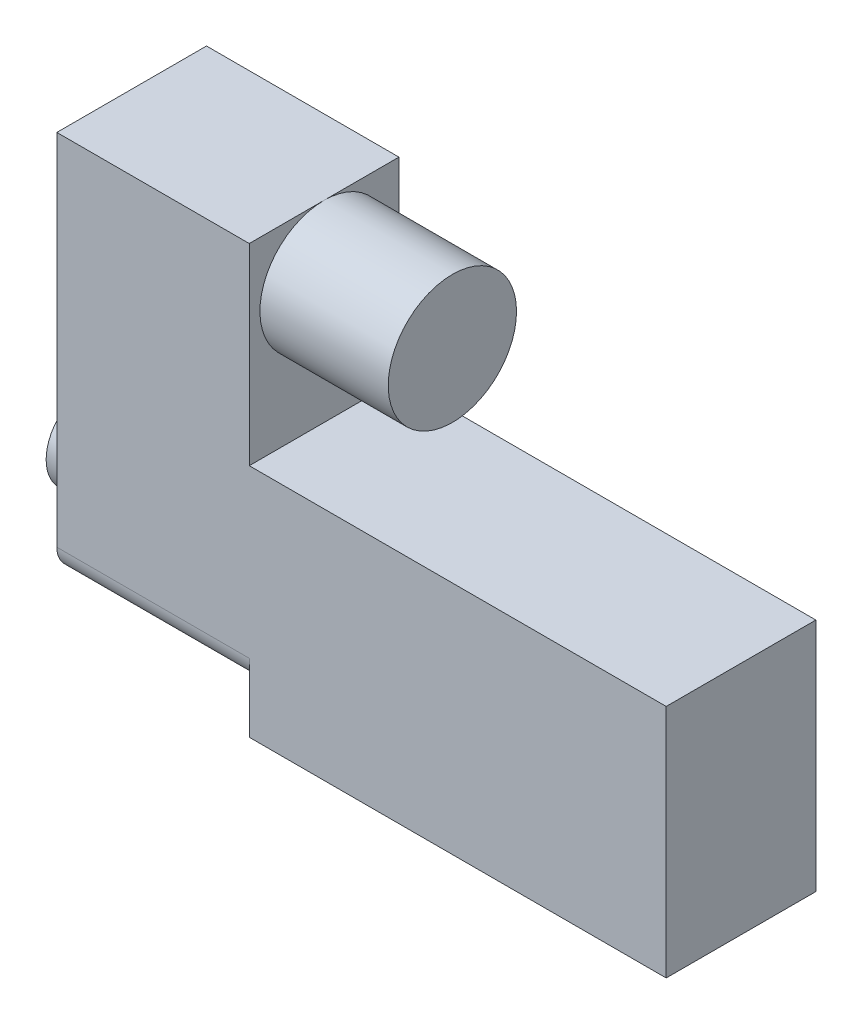
ISO-10303-21;
HEADER;
FILE_DESCRIPTION(('STEP AP214'),'2;1');
FILE_NAME('part.step','',(''),(''),'','','');
FILE_SCHEMA(('AUTOMOTIVE_DESIGN { 1 0 10303 214 1 1 1 1 }'));
ENDSEC;
DATA;
#1=APPLICATION_CONTEXT('core data for automotive mechanical design processes');
#2=APPLICATION_PROTOCOL_DEFINITION('international standard','automotive_design',2000,#1);
#3=PRODUCT_CONTEXT('',#1,'mechanical');
#4=PRODUCT('Part','Part','',(#3));
#5=PRODUCT_RELATED_PRODUCT_CATEGORY('part','',(#4));
#6=PRODUCT_DEFINITION_FORMATION('','',#4);
#7=PRODUCT_DEFINITION_CONTEXT('part definition',#1,'design');
#8=PRODUCT_DEFINITION('design','',#6,#7);
#9=PRODUCT_DEFINITION_SHAPE('','',#8);
#10=(LENGTH_UNIT() NAMED_UNIT(*) SI_UNIT(.MILLI.,.METRE.));
#11=(NAMED_UNIT(*) PLANE_ANGLE_UNIT() SI_UNIT($,.RADIAN.));
#12=(NAMED_UNIT(*) SI_UNIT($,.STERADIAN.) SOLID_ANGLE_UNIT());
#13=UNCERTAINTY_MEASURE_WITH_UNIT(LENGTH_MEASURE(1.E-05),#10,'distance_accuracy_value','');
#14=(GEOMETRIC_REPRESENTATION_CONTEXT(3) GLOBAL_UNCERTAINTY_ASSIGNED_CONTEXT((#13)) GLOBAL_UNIT_ASSIGNED_CONTEXT((#10,
#11,#12)) REPRESENTATION_CONTEXT('',''));
#15=CARTESIAN_POINT('',(0.,0.,0.));
#16=DIRECTION('',(0.,0.,1.));
#17=DIRECTION('',(1.,0.,0.));
#18=AXIS2_PLACEMENT_3D('',#15,#16,#17);
#19=CARTESIAN_POINT('',(-28.575,0.,0.));
#20=DIRECTION('',(-1.,0.,0.));
#21=DIRECTION('',(0.,0.,1.));
#22=AXIS2_PLACEMENT_3D('',#19,#20,#21);
#23=PLANE('',#22);
#24=DIRECTION('',(0.,-1.,0.));
#25=VECTOR('',#24,1.);
#26=CARTESIAN_POINT('',(-28.575,34.925,-22.225));
#27=LINE('',#26,#25);
#28=CARTESIAN_POINT('',(-28.575,63.5,-22.225));
#29=VERTEX_POINT('',#28);
#30=CARTESIAN_POINT('',(-28.575,10.16,-22.225));
#31=VERTEX_POINT('',#30);
#32=EDGE_CURVE('E143',#29,#31,#27,.T.);
#33=ORIENTED_EDGE('',*,*,#32,.T.);
#34=CARTESIAN_POINT('',(-28.575,10.16,-18.415));
#35=DIRECTION('',(-1.,0.,0.));
#36=DIRECTION('',(0.,0.,1.));
#37=AXIS2_PLACEMENT_3D('',#34,#35,#36);
#38=CIRCLE('',#37,3.81);
#39=CARTESIAN_POINT('',(-28.575,6.35,-18.415));
#40=VERTEX_POINT('',#39);
#41=EDGE_CURVE('E212',#31,#40,#38,.T.);
#42=ORIENTED_EDGE('',*,*,#41,.T.);
#43=DIRECTION('',(0.,0.,1.));
#44=VECTOR('',#43,1.);
#45=CARTESIAN_POINT('',(-28.575,6.35,-22.225));
#46=LINE('',#45,#44);
#47=CARTESIAN_POINT('',(-28.575,6.35,-3.81));
#48=VERTEX_POINT('',#47);
#49=EDGE_CURVE('E227',#40,#48,#46,.T.);
#50=ORIENTED_EDGE('',*,*,#49,.T.);
#51=CARTESIAN_POINT('',(-28.575,10.16,-3.81));
#52=DIRECTION('',(-1.,0.,0.));
#53=DIRECTION('',(0.,0.,1.));
#54=AXIS2_PLACEMENT_3D('',#51,#52,#53);
#55=CIRCLE('',#54,3.81);
#56=CARTESIAN_POINT('',(-28.575,10.16,0.));
#57=VERTEX_POINT('',#56);
#58=EDGE_CURVE('E57',#48,#57,#55,.T.);
#59=ORIENTED_EDGE('',*,*,#58,.T.);
#60=DIRECTION('',(0.,1.,0.));
#61=VECTOR('',#60,1.);
#62=CARTESIAN_POINT('',(-28.575,34.925,0.));
#63=LINE('',#62,#61);
#64=CARTESIAN_POINT('',(-28.575,63.5,0.));
#65=VERTEX_POINT('',#64);
#66=EDGE_CURVE('E168',#57,#65,#63,.T.);
#67=ORIENTED_EDGE('',*,*,#66,.T.);
#68=DIRECTION('',(0.,0.,1.));
#69=VECTOR('',#68,1.);
#70=CARTESIAN_POINT('',(-28.575,63.5,-22.225));
#71=LINE('',#70,#69);
#72=EDGE_CURVE('E136',#29,#65,#71,.T.);
#73=ORIENTED_EDGE('',*,*,#72,.F.);
#74=EDGE_LOOP('',(#33,#42,#50,#59,#67,#73));
#75=FACE_BOUND('',#74,.T.);
#76=CARTESIAN_POINT('',(-28.575,15.875,-11.1125));
#77=DIRECTION('',(-1.,0.,0.));
#78=DIRECTION('',(0.,0.,1.));
#79=AXIS2_PLACEMENT_3D('',#76,#77,#78);
#80=CIRCLE('',#79,6.35);
#81=CARTESIAN_POINT('',(-28.575,15.875,-4.76249999999999));
#82=VERTEX_POINT('',#81);
#83=EDGE_CURVE('E245',#82,#82,#80,.T.);
#84=ORIENTED_EDGE('',*,*,#83,.F.);
#85=EDGE_LOOP('',(#84));
#86=FACE_BOUND('',#85,.T.);
#87=ADVANCED_FACE('F35',(#75,#86),#23,.T.);
#88=CARTESIAN_POINT('',(0.,63.5,-22.225));
#89=DIRECTION('',(-1.,0.,0.));
#90=DIRECTION('',(0.,0.,1.));
#91=AXIS2_PLACEMENT_3D('',#88,#89,#90);
#92=PLANE('',#91);
#93=DIRECTION('',(0.,0.,-1.));
#94=VECTOR('',#93,1.);
#95=CARTESIAN_POINT('',(0.,63.5,-22.225));
#96=LINE('',#95,#94);
#97=CARTESIAN_POINT('',(0.,63.5,-11.1125));
#98=VERTEX_POINT('',#97);
#99=CARTESIAN_POINT('',(0.,63.5,-22.225));
#100=VERTEX_POINT('',#99);
#101=EDGE_CURVE('E119',#98,#100,#96,.T.);
#102=ORIENTED_EDGE('',*,*,#101,.F.);
#103=CARTESIAN_POINT('',(0.,53.975,-11.1125));
#104=DIRECTION('',(1.,0.,0.));
#105=DIRECTION('',(0.,0.,-1.));
#106=AXIS2_PLACEMENT_3D('',#103,#104,#105);
#107=CIRCLE('',#106,9.525);
#108=EDGE_CURVE('E131',#98,#98,#107,.T.);
#109=ORIENTED_EDGE('',*,*,#108,.F.);
#110=CARTESIAN_POINT('',(0.,63.5,0.));
#111=VERTEX_POINT('',#110);
#112=EDGE_CURVE('E114',#111,#98,#96,.T.);
#113=ORIENTED_EDGE('',*,*,#112,.F.);
#114=DIRECTION('',(0.,-1.,0.));
#115=VECTOR('',#114,1.);
#116=CARTESIAN_POINT('',(0.,63.5,0.));
#117=LINE('',#116,#115);
#118=CARTESIAN_POINT('',(0.,34.925,0.));
#119=VERTEX_POINT('',#118);
#120=EDGE_CURVE('E154',#111,#119,#117,.T.);
#121=ORIENTED_EDGE('',*,*,#120,.T.);
#122=DIRECTION('',(0.,0.,-1.));
#123=VECTOR('',#122,1.);
#124=CARTESIAN_POINT('',(0.,34.925,-22.225));
#125=LINE('',#124,#123);
#126=CARTESIAN_POINT('',(0.,34.925,-22.225));
#127=VERTEX_POINT('',#126);
#128=EDGE_CURVE('E146',#119,#127,#125,.T.);
#129=ORIENTED_EDGE('',*,*,#128,.T.);
#130=DIRECTION('',(0.,-1.,0.));
#131=VECTOR('',#130,1.);
#132=CARTESIAN_POINT('',(0.,63.5,-22.225));
#133=LINE('',#132,#131);
#134=EDGE_CURVE('E134',#100,#127,#133,.T.);
#135=ORIENTED_EDGE('',*,*,#134,.F.);
#136=EDGE_LOOP('',(#102,#109,#113,#121,#129,#135));
#137=FACE_BOUND('',#136,.T.);
#138=ADVANCED_FACE('F129',(#137),#92,.F.);
#139=CARTESIAN_POINT('',(0.,34.925,0.));
#140=DIRECTION('',(0.,-1.,0.));
#141=DIRECTION('',(0.,0.,-1.));
#142=AXIS2_PLACEMENT_3D('',#139,#140,#141);
#143=PLANE('',#142);
#144=ORIENTED_EDGE('',*,*,#128,.F.);
#145=DIRECTION('',(1.,0.,0.));
#146=VECTOR('',#145,1.);
#147=CARTESIAN_POINT('',(0.,34.925,0.));
#148=LINE('',#147,#146);
#149=CARTESIAN_POINT('',(61.9125,34.925,0.));
#150=VERTEX_POINT('',#149);
#151=EDGE_CURVE('E150',#119,#150,#148,.T.);
#152=ORIENTED_EDGE('',*,*,#151,.T.);
#153=DIRECTION('',(0.,0.,-1.));
#154=VECTOR('',#153,1.);
#155=CARTESIAN_POINT('',(61.9125,34.925,0.));
#156=LINE('',#155,#154);
#157=CARTESIAN_POINT('',(61.9125,34.925,-22.225));
#158=VERTEX_POINT('',#157);
#159=EDGE_CURVE('E171',#150,#158,#156,.T.);
#160=ORIENTED_EDGE('',*,*,#159,.T.);
#161=DIRECTION('',(-1.,0.,0.));
#162=VECTOR('',#161,1.);
#163=CARTESIAN_POINT('',(0.,34.925,-22.225));
#164=LINE('',#163,#162);
#165=EDGE_CURVE('E173',#158,#127,#164,.T.);
#166=ORIENTED_EDGE('',*,*,#165,.T.);
#167=EDGE_LOOP('',(#144,#152,#160,#166));
#168=FACE_BOUND('',#167,.T.);
#169=ADVANCED_FACE('F235',(#168),#143,.F.);
#170=CARTESIAN_POINT('',(0.,34.925,0.));
#171=DIRECTION('',(1.,0.,0.));
#172=DIRECTION('',(0.,0.,-1.));
#173=AXIS2_PLACEMENT_3D('',#170,#171,#172);
#174=PLANE('',#173);
#175=DIRECTION('',(0.,0.,1.));
#176=VECTOR('',#175,1.);
#177=CARTESIAN_POINT('',(0.,6.35,-22.225));
#178=LINE('',#177,#176);
#179=CARTESIAN_POINT('',(0.,6.35,-18.415));
#180=VERTEX_POINT('',#179);
#181=CARTESIAN_POINT('',(0.,6.35,-3.81));
#182=VERTEX_POINT('',#181);
#183=EDGE_CURVE('E158',#180,#182,#178,.T.);
#184=ORIENTED_EDGE('',*,*,#183,.F.);
#185=CARTESIAN_POINT('',(0.,10.16,-18.415));
#186=DIRECTION('',(1.,0.,0.));
#187=DIRECTION('',(0.,0.,-1.));
#188=AXIS2_PLACEMENT_3D('',#185,#186,#187);
#189=CIRCLE('',#188,3.81);
#190=CARTESIAN_POINT('',(0.,10.16,-22.225));
#191=VERTEX_POINT('',#190);
#192=EDGE_CURVE('E43',#180,#191,#189,.T.);
#193=ORIENTED_EDGE('',*,*,#192,.T.);
#194=DIRECTION('',(0.,-1.,0.));
#195=VECTOR('',#194,1.);
#196=CARTESIAN_POINT('',(0.,34.925,-22.225));
#197=LINE('',#196,#195);
#198=CARTESIAN_POINT('',(0.,0.,-22.225));
#199=VERTEX_POINT('',#198);
#200=EDGE_CURVE('E179',#191,#199,#197,.T.);
#201=ORIENTED_EDGE('',*,*,#200,.T.);
#202=DIRECTION('',(0.,0.,1.));
#203=VECTOR('',#202,1.);
#204=CARTESIAN_POINT('',(0.,0.,0.));
#205=LINE('',#204,#203);
#206=CARTESIAN_POINT('',(0.,0.,0.));
#207=VERTEX_POINT('',#206);
#208=EDGE_CURVE('E176',#199,#207,#205,.T.);
#209=ORIENTED_EDGE('',*,*,#208,.T.);
#210=DIRECTION('',(0.,-1.,0.));
#211=VECTOR('',#210,1.);
#212=CARTESIAN_POINT('',(0.,34.925,0.));
#213=LINE('',#212,#211);
#214=CARTESIAN_POINT('',(0.,10.16,0.));
#215=VERTEX_POINT('',#214);
#216=EDGE_CURVE('E49',#215,#207,#213,.T.);
#217=ORIENTED_EDGE('',*,*,#216,.F.);
#218=CARTESIAN_POINT('',(0.,10.16,-3.81));
#219=DIRECTION('',(1.,0.,0.));
#220=DIRECTION('',(0.,0.,-1.));
#221=AXIS2_PLACEMENT_3D('',#218,#219,#220);
#222=CIRCLE('',#221,3.81);
#223=EDGE_CURVE('E11',#215,#182,#222,.T.);
#224=ORIENTED_EDGE('',*,*,#223,.T.);
#225=EDGE_LOOP('',(#184,#193,#201,#209,#217,#224));
#226=FACE_BOUND('',#225,.T.);
#227=ADVANCED_FACE('F217',(#226),#174,.F.);
#228=CARTESIAN_POINT('',(0.,34.925,0.));
#229=DIRECTION('',(0.,0.,-1.));
#230=DIRECTION('',(-1.,0.,0.));
#231=AXIS2_PLACEMENT_3D('',#228,#229,#230);
#232=PLANE('',#231);
#233=ORIENTED_EDGE('',*,*,#66,.F.);
#234=DIRECTION('',(1.,0.,0.));
#235=VECTOR('',#234,1.);
#236=CARTESIAN_POINT('',(0.,10.16,0.));
#237=LINE('',#236,#235);
#238=EDGE_CURVE('E214',#57,#215,#237,.T.);
#239=ORIENTED_EDGE('',*,*,#238,.T.);
#240=ORIENTED_EDGE('',*,*,#216,.T.);
#241=DIRECTION('',(1.,0.,0.));
#242=VECTOR('',#241,1.);
#243=CARTESIAN_POINT('',(0.,0.,0.));
#244=LINE('',#243,#242);
#245=CARTESIAN_POINT('',(61.9125,0.,0.));
#246=VERTEX_POINT('',#245);
#247=EDGE_CURVE('E228',#207,#246,#244,.T.);
#248=ORIENTED_EDGE('',*,*,#247,.T.);
#249=DIRECTION('',(0.,-1.,0.));
#250=VECTOR('',#249,1.);
#251=CARTESIAN_POINT('',(61.9125,34.925,0.));
#252=LINE('',#251,#250);
#253=EDGE_CURVE('E191',#150,#246,#252,.T.);
#254=ORIENTED_EDGE('',*,*,#253,.F.);
#255=ORIENTED_EDGE('',*,*,#151,.F.);
#256=ORIENTED_EDGE('',*,*,#120,.F.);
#257=DIRECTION('',(1.,0.,0.));
#258=VECTOR('',#257,1.);
#259=CARTESIAN_POINT('',(-28.575,63.5,0.));
#260=LINE('',#259,#258);
#261=EDGE_CURVE('E122',#65,#111,#260,.T.);
#262=ORIENTED_EDGE('',*,*,#261,.F.);
#263=EDGE_LOOP('',(#233,#239,#240,#248,#254,#255,#256,#262));
#264=FACE_BOUND('',#263,.T.);
#265=ADVANCED_FACE('F236',(#264),#232,.F.);
#266=CARTESIAN_POINT('',(61.9125,34.925,0.));
#267=DIRECTION('',(-1.,0.,0.));
#268=DIRECTION('',(0.,0.,1.));
#269=AXIS2_PLACEMENT_3D('',#266,#267,#268);
#270=PLANE('',#269);
#271=DIRECTION('',(0.,0.,-1.));
#272=VECTOR('',#271,1.);
#273=CARTESIAN_POINT('',(61.9125,0.,0.));
#274=LINE('',#273,#272);
#275=CARTESIAN_POINT('',(61.9125,0.,-22.225));
#276=VERTEX_POINT('',#275);
#277=EDGE_CURVE('E230',#246,#276,#274,.T.);
#278=ORIENTED_EDGE('',*,*,#277,.T.);
#279=DIRECTION('',(0.,-1.,0.));
#280=VECTOR('',#279,1.);
#281=CARTESIAN_POINT('',(61.9125,34.925,-22.225));
#282=LINE('',#281,#280);
#283=EDGE_CURVE('E182',#158,#276,#282,.T.);
#284=ORIENTED_EDGE('',*,*,#283,.F.);
#285=ORIENTED_EDGE('',*,*,#159,.F.);
#286=ORIENTED_EDGE('',*,*,#253,.T.);
#287=EDGE_LOOP('',(#278,#284,#285,#286));
#288=FACE_BOUND('',#287,.T.);
#289=ADVANCED_FACE('F237',(#288),#270,.F.);
#290=CARTESIAN_POINT('',(0.,34.925,-22.225));
#291=DIRECTION('',(0.,0.,1.));
#292=DIRECTION('',(1.,0.,0.));
#293=AXIS2_PLACEMENT_3D('',#290,#291,#292);
#294=PLANE('',#293);
#295=ORIENTED_EDGE('',*,*,#200,.F.);
#296=DIRECTION('',(1.,0.,0.));
#297=VECTOR('',#296,1.);
#298=CARTESIAN_POINT('',(0.,10.16,-22.225));
#299=LINE('',#298,#297);
#300=EDGE_CURVE('E206',#191,#31,#299,.F.);
#301=ORIENTED_EDGE('',*,*,#300,.T.);
#302=ORIENTED_EDGE('',*,*,#32,.F.);
#303=DIRECTION('',(-1.,0.,0.));
#304=VECTOR('',#303,1.);
#305=CARTESIAN_POINT('',(-28.575,63.5,-22.225));
#306=LINE('',#305,#304);
#307=EDGE_CURVE('E127',#100,#29,#306,.T.);
#308=ORIENTED_EDGE('',*,*,#307,.F.);
#309=ORIENTED_EDGE('',*,*,#134,.T.);
#310=ORIENTED_EDGE('',*,*,#165,.F.);
#311=ORIENTED_EDGE('',*,*,#283,.T.);
#312=DIRECTION('',(-1.,0.,0.));
#313=VECTOR('',#312,1.);
#314=CARTESIAN_POINT('',(0.,0.,-22.225));
#315=LINE('',#314,#313);
#316=EDGE_CURVE('E187',#276,#199,#315,.T.);
#317=ORIENTED_EDGE('',*,*,#316,.T.);
#318=EDGE_LOOP('',(#295,#301,#302,#308,#309,#310,#311,#317));
#319=FACE_BOUND('',#318,.T.);
#320=ADVANCED_FACE('F224',(#319),#294,.F.);
#321=CARTESIAN_POINT('',(0.,0.,0.));
#322=DIRECTION('',(0.,-1.,0.));
#323=DIRECTION('',(0.,0.,-1.));
#324=AXIS2_PLACEMENT_3D('',#321,#322,#323);
#325=PLANE('',#324);
#326=ORIENTED_EDGE('',*,*,#208,.F.);
#327=ORIENTED_EDGE('',*,*,#316,.F.);
#328=ORIENTED_EDGE('',*,*,#277,.F.);
#329=ORIENTED_EDGE('',*,*,#247,.F.);
#330=EDGE_LOOP('',(#326,#327,#328,#329));
#331=FACE_BOUND('',#330,.T.);
#332=ADVANCED_FACE('F270',(#331),#325,.T.);
#333=CARTESIAN_POINT('',(-28.575,6.35,-22.225));
#334=DIRECTION('',(0.,1.,0.));
#335=DIRECTION('',(0.,0.,1.));
#336=AXIS2_PLACEMENT_3D('',#333,#334,#335);
#337=PLANE('',#336);
#338=ORIENTED_EDGE('',*,*,#49,.F.);
#339=DIRECTION('',(1.,0.,0.));
#340=VECTOR('',#339,1.);
#341=CARTESIAN_POINT('',(-28.575,6.35,-18.415));
#342=LINE('',#341,#340);
#343=EDGE_CURVE('E201',#40,#180,#342,.T.);
#344=ORIENTED_EDGE('',*,*,#343,.T.);
#345=ORIENTED_EDGE('',*,*,#183,.T.);
#346=DIRECTION('',(1.,0.,0.));
#347=VECTOR('',#346,1.);
#348=CARTESIAN_POINT('',(-28.575,6.35,-3.81));
#349=LINE('',#348,#347);
#350=EDGE_CURVE('E164',#182,#48,#349,.F.);
#351=ORIENTED_EDGE('',*,*,#350,.T.);
#352=EDGE_LOOP('',(#338,#344,#345,#351));
#353=FACE_BOUND('',#352,.T.);
#354=ADVANCED_FACE('F267',(#353),#337,.F.);
#355=CARTESIAN_POINT('',(0.,63.5,0.));
#356=DIRECTION('',(0.,1.,0.));
#357=DIRECTION('',(0.,0.,1.));
#358=AXIS2_PLACEMENT_3D('',#355,#356,#357);
#359=PLANE('',#358);
#360=ORIENTED_EDGE('',*,*,#72,.T.);
#361=ORIENTED_EDGE('',*,*,#261,.T.);
#362=ORIENTED_EDGE('',*,*,#112,.T.);
#363=ORIENTED_EDGE('',*,*,#101,.T.);
#364=ORIENTED_EDGE('',*,*,#307,.T.);
#365=EDGE_LOOP('',(#360,#361,#362,#363,#364));
#366=FACE_BOUND('',#365,.T.);
#367=ADVANCED_FACE('F117',(#366),#359,.T.);
#368=CARTESIAN_POINT('',(19.05,53.975,-11.1125));
#369=DIRECTION('',(-1.,0.,0.));
#370=DIRECTION('',(0.,0.,1.));
#371=AXIS2_PLACEMENT_3D('',#368,#369,#370);
#372=CYLINDRICAL_SURFACE('',#371,9.525);
#373=CARTESIAN_POINT('',(19.05,53.975,-11.1125));
#374=DIRECTION('',(1.,0.,0.));
#375=DIRECTION('',(0.,0.,-1.));
#376=AXIS2_PLACEMENT_3D('',#373,#374,#375);
#377=CIRCLE('',#376,9.525);
#378=CARTESIAN_POINT('',(19.05,53.975,-20.6375));
#379=VERTEX_POINT('',#378);
#380=EDGE_CURVE('E149',#379,#379,#377,.T.);
#381=ORIENTED_EDGE('',*,*,#380,.F.);
#382=EDGE_LOOP('',(#381));
#383=FACE_BOUND('',#382,.T.);
#384=ORIENTED_EDGE('',*,*,#108,.T.);
#385=EDGE_LOOP('',(#384));
#386=FACE_BOUND('',#385,.T.);
#387=ADVANCED_FACE('F295',(#383,#386),#372,.T.);
#388=CARTESIAN_POINT('',(19.05,53.975,-11.1125));
#389=DIRECTION('',(1.,0.,0.));
#390=DIRECTION('',(0.,0.,-1.));
#391=AXIS2_PLACEMENT_3D('',#388,#389,#390);
#392=PLANE('',#391);
#393=ORIENTED_EDGE('',*,*,#380,.T.);
#394=EDGE_LOOP('',(#393));
#395=FACE_BOUND('',#394,.T.);
#396=ADVANCED_FACE('F256',(#395),#392,.T.);
#397=CARTESIAN_POINT('',(-34.925,15.875,-11.1125));
#398=DIRECTION('',(1.,0.,0.));
#399=DIRECTION('',(0.,0.,-1.));
#400=AXIS2_PLACEMENT_3D('',#397,#398,#399);
#401=CYLINDRICAL_SURFACE('',#400,6.35);
#402=CARTESIAN_POINT('',(-34.925,15.875,-11.1125));
#403=DIRECTION('',(-1.,0.,0.));
#404=DIRECTION('',(0.,0.,1.));
#405=AXIS2_PLACEMENT_3D('',#402,#403,#404);
#406=CIRCLE('',#405,6.35);
#407=CARTESIAN_POINT('',(-34.925,15.875,-4.76249999999999));
#408=VERTEX_POINT('',#407);
#409=EDGE_CURVE('E242',#408,#408,#406,.T.);
#410=ORIENTED_EDGE('',*,*,#409,.F.);
#411=EDGE_LOOP('',(#410));
#412=FACE_BOUND('',#411,.T.);
#413=ORIENTED_EDGE('',*,*,#83,.T.);
#414=EDGE_LOOP('',(#413));
#415=FACE_BOUND('',#414,.T.);
#416=ADVANCED_FACE('F253',(#412,#415),#401,.T.);
#417=CARTESIAN_POINT('',(-34.925,15.875,-11.1125));
#418=DIRECTION('',(-1.,0.,0.));
#419=DIRECTION('',(0.,0.,1.));
#420=AXIS2_PLACEMENT_3D('',#417,#418,#419);
#421=PLANE('',#420);
#422=ORIENTED_EDGE('',*,*,#409,.T.);
#423=EDGE_LOOP('',(#422));
#424=FACE_BOUND('',#423,.T.);
#425=ADVANCED_FACE('F251',(#424),#421,.T.);
#426=CARTESIAN_POINT('',(-28.575,10.16,-18.415));
#427=DIRECTION('',(1.,0.,0.));
#428=DIRECTION('',(0.,0.,-1.));
#429=AXIS2_PLACEMENT_3D('',#426,#427,#428);
#430=CYLINDRICAL_SURFACE('',#429,3.81);
#431=ORIENTED_EDGE('',*,*,#41,.F.);
#432=ORIENTED_EDGE('',*,*,#300,.F.);
#433=ORIENTED_EDGE('',*,*,#192,.F.);
#434=ORIENTED_EDGE('',*,*,#343,.F.);
#435=EDGE_LOOP('',(#431,#432,#433,#434));
#436=FACE_BOUND('',#435,.T.);
#437=ADVANCED_FACE('F221',(#436),#430,.T.);
#438=CARTESIAN_POINT('',(0.,10.16,-3.81));
#439=DIRECTION('',(1.,0.,0.));
#440=DIRECTION('',(0.,0.,-1.));
#441=AXIS2_PLACEMENT_3D('',#438,#439,#440);
#442=CYLINDRICAL_SURFACE('',#441,3.81);
#443=ORIENTED_EDGE('',*,*,#58,.F.);
#444=ORIENTED_EDGE('',*,*,#350,.F.);
#445=ORIENTED_EDGE('',*,*,#223,.F.);
#446=ORIENTED_EDGE('',*,*,#238,.F.);
#447=EDGE_LOOP('',(#443,#444,#445,#446));
#448=FACE_BOUND('',#447,.T.);
#449=ADVANCED_FACE('F37',(#448),#442,.T.);
#450=CLOSED_SHELL('',(#87,#138,#169,#227,#265,#289,#320,#332,#354,#367,#387,#396,#416,#425,#437,#449));
#451=MANIFOLD_SOLID_BREP('B2',#450);
#452=ADVANCED_BREP_SHAPE_REPRESENTATION('',(#18,#451),#14);
#453=SHAPE_DEFINITION_REPRESENTATION(#9,#452);
ENDSEC;
END-ISO-10303-21;
